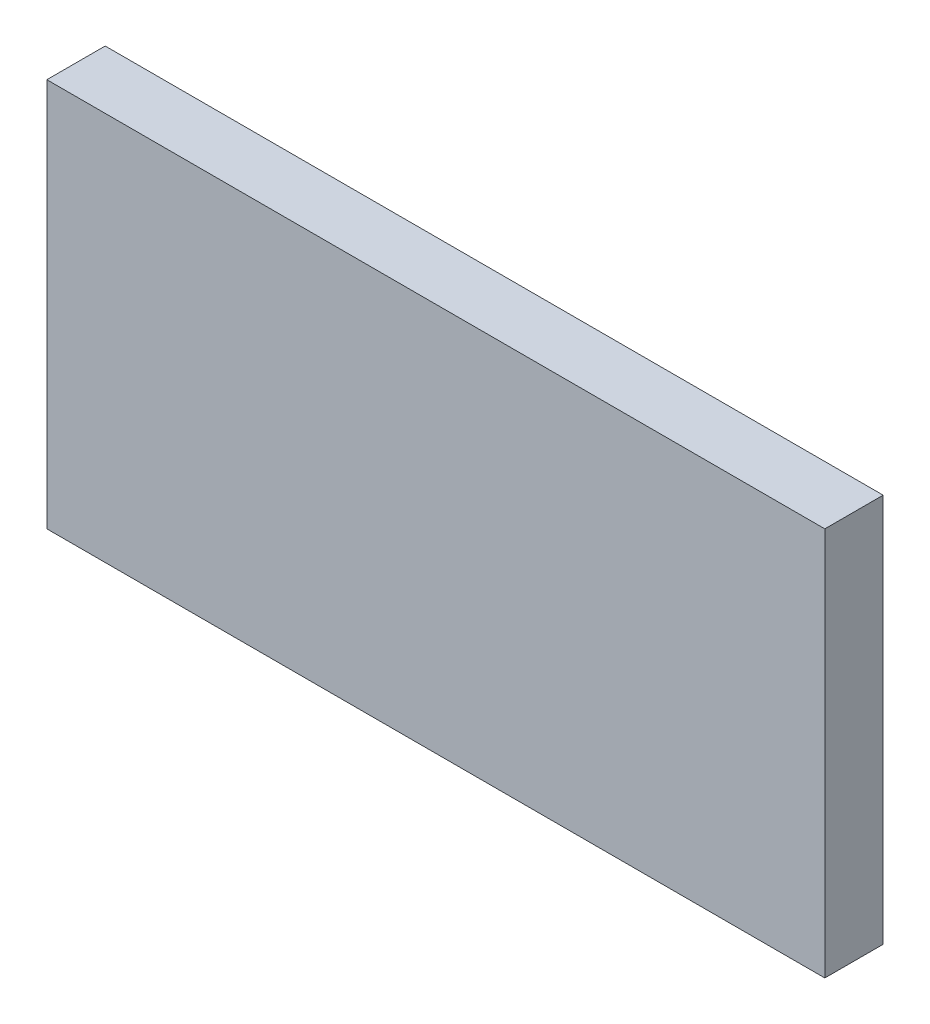
ISO-10303-21;
HEADER;
FILE_DESCRIPTION(('STEP AP214'),'2;1');
FILE_NAME('part.step','',(''),(''),'','','');
FILE_SCHEMA(('AUTOMOTIVE_DESIGN { 1 0 10303 214 1 1 1 1 }'));
ENDSEC;
DATA;
#1=APPLICATION_CONTEXT('core data for automotive mechanical design processes');
#2=APPLICATION_PROTOCOL_DEFINITION('international standard','automotive_design',2000,#1);
#3=PRODUCT_CONTEXT('',#1,'mechanical');
#4=PRODUCT('Part','Part','',(#3));
#5=PRODUCT_RELATED_PRODUCT_CATEGORY('part','',(#4));
#6=PRODUCT_DEFINITION_FORMATION('','',#4);
#7=PRODUCT_DEFINITION_CONTEXT('part definition',#1,'design');
#8=PRODUCT_DEFINITION('design','',#6,#7);
#9=PRODUCT_DEFINITION_SHAPE('','',#8);
#10=(LENGTH_UNIT() NAMED_UNIT(*) SI_UNIT(.MILLI.,.METRE.));
#11=(NAMED_UNIT(*) PLANE_ANGLE_UNIT() SI_UNIT($,.RADIAN.));
#12=(NAMED_UNIT(*) SI_UNIT($,.STERADIAN.) SOLID_ANGLE_UNIT());
#13=UNCERTAINTY_MEASURE_WITH_UNIT(LENGTH_MEASURE(1.E-05),#10,'distance_accuracy_value','');
#14=(GEOMETRIC_REPRESENTATION_CONTEXT(3) GLOBAL_UNCERTAINTY_ASSIGNED_CONTEXT((#13)) GLOBAL_UNIT_ASSIGNED_CONTEXT((#10,
#11,#12)) REPRESENTATION_CONTEXT('',''));
#15=CARTESIAN_POINT('',(0.,0.,0.));
#16=DIRECTION('',(0.,0.,1.));
#17=DIRECTION('',(1.,0.,0.));
#18=AXIS2_PLACEMENT_3D('',#15,#16,#17);
#19=CARTESIAN_POINT('',(-19.0244177165515,8.79518072289157,3.));
#20=DIRECTION('',(1.,0.,0.));
#21=DIRECTION('',(0.,1.,0.));
#22=AXIS2_PLACEMENT_3D('',#19,#20,#21);
#23=PLANE('',#22);
#24=DIRECTION('',(0.,-1.,0.));
#25=VECTOR('',#24,1.);
#26=CARTESIAN_POINT('',(-19.0244177165515,8.79518072289157,0.));
#27=LINE('',#26,#25);
#28=CARTESIAN_POINT('',(-19.0244177165515,8.79518072289157,0.));
#29=VERTEX_POINT('',#28);
#30=CARTESIAN_POINT('',(-19.0244177165515,-11.2048192771084,0.));
#31=VERTEX_POINT('',#30);
#32=EDGE_CURVE('E101',#29,#31,#27,.T.);
#33=ORIENTED_EDGE('',*,*,#32,.T.);
#34=DIRECTION('',(0.,0.,-1.));
#35=VECTOR('',#34,1.);
#36=CARTESIAN_POINT('',(-19.0244177165515,-11.2048192771084,3.));
#37=LINE('',#36,#35);
#38=CARTESIAN_POINT('',(-19.0244177165515,-11.2048192771084,3.));
#39=VERTEX_POINT('',#38);
#40=EDGE_CURVE('E11',#39,#31,#37,.T.);
#41=ORIENTED_EDGE('',*,*,#40,.F.);
#42=DIRECTION('',(0.,-1.,0.));
#43=VECTOR('',#42,1.);
#44=CARTESIAN_POINT('',(-19.0244177165515,8.79518072289157,3.));
#45=LINE('',#44,#43);
#46=CARTESIAN_POINT('',(-19.0244177165515,8.79518072289157,3.));
#47=VERTEX_POINT('',#46);
#48=EDGE_CURVE('E89',#47,#39,#45,.T.);
#49=ORIENTED_EDGE('',*,*,#48,.F.);
#50=DIRECTION('',(0.,0.,-1.));
#51=VECTOR('',#50,1.);
#52=CARTESIAN_POINT('',(-19.0244177165515,8.79518072289157,3.));
#53=LINE('',#52,#51);
#54=EDGE_CURVE('E97',#47,#29,#53,.T.);
#55=ORIENTED_EDGE('',*,*,#54,.T.);
#56=EDGE_LOOP('',(#33,#41,#49,#55));
#57=FACE_BOUND('',#56,.T.);
#58=ADVANCED_FACE('F38',(#57),#23,.F.);
#59=CARTESIAN_POINT('',(-19.0244177165515,-11.2048192771084,3.));
#60=DIRECTION('',(0.,1.,0.));
#61=DIRECTION('',(0.,0.,1.));
#62=AXIS2_PLACEMENT_3D('',#59,#60,#61);
#63=PLANE('',#62);
#64=DIRECTION('',(1.,0.,0.));
#65=VECTOR('',#64,1.);
#66=CARTESIAN_POINT('',(-19.0244177165515,-11.2048192771084,0.));
#67=LINE('',#66,#65);
#68=CARTESIAN_POINT('',(20.9755822834485,-11.2048192771084,0.));
#69=VERTEX_POINT('',#68);
#70=EDGE_CURVE('E93',#31,#69,#67,.T.);
#71=ORIENTED_EDGE('',*,*,#70,.T.);
#72=DIRECTION('',(0.,0.,-1.));
#73=VECTOR('',#72,1.);
#74=CARTESIAN_POINT('',(20.9755822834485,-11.2048192771084,3.));
#75=LINE('',#74,#73);
#76=CARTESIAN_POINT('',(20.9755822834485,-11.2048192771084,3.));
#77=VERTEX_POINT('',#76);
#78=EDGE_CURVE('E46',#77,#69,#75,.T.);
#79=ORIENTED_EDGE('',*,*,#78,.F.);
#80=DIRECTION('',(1.,0.,0.));
#81=VECTOR('',#80,1.);
#82=CARTESIAN_POINT('',(-19.0244177165515,-11.2048192771084,3.));
#83=LINE('',#82,#81);
#84=EDGE_CURVE('E84',#39,#77,#83,.T.);
#85=ORIENTED_EDGE('',*,*,#84,.F.);
#86=ORIENTED_EDGE('',*,*,#40,.T.);
#87=EDGE_LOOP('',(#71,#79,#85,#86));
#88=FACE_BOUND('',#87,.T.);
#89=ADVANCED_FACE('F92',(#88),#63,.F.);
#90=CARTESIAN_POINT('',(20.9755822834485,8.79518072289157,3.));
#91=DIRECTION('',(-1.,0.,0.));
#92=DIRECTION('',(0.,-1.,0.));
#93=AXIS2_PLACEMENT_3D('',#90,#91,#92);
#94=PLANE('',#93);
#95=DIRECTION('',(0.,1.,0.));
#96=VECTOR('',#95,1.);
#97=CARTESIAN_POINT('',(20.9755822834485,8.79518072289157,0.));
#98=LINE('',#97,#96);
#99=CARTESIAN_POINT('',(20.9755822834485,8.79518072289157,0.));
#100=VERTEX_POINT('',#99);
#101=EDGE_CURVE('E71',#69,#100,#98,.T.);
#102=ORIENTED_EDGE('',*,*,#101,.T.);
#103=DIRECTION('',(0.,0.,-1.));
#104=VECTOR('',#103,1.);
#105=CARTESIAN_POINT('',(20.9755822834485,8.79518072289157,3.));
#106=LINE('',#105,#104);
#107=CARTESIAN_POINT('',(20.9755822834485,8.79518072289157,3.));
#108=VERTEX_POINT('',#107);
#109=EDGE_CURVE('E94',#108,#100,#106,.T.);
#110=ORIENTED_EDGE('',*,*,#109,.F.);
#111=DIRECTION('',(0.,1.,0.));
#112=VECTOR('',#111,1.);
#113=CARTESIAN_POINT('',(20.9755822834485,8.79518072289157,3.));
#114=LINE('',#113,#112);
#115=EDGE_CURVE('E87',#77,#108,#114,.T.);
#116=ORIENTED_EDGE('',*,*,#115,.F.);
#117=ORIENTED_EDGE('',*,*,#78,.T.);
#118=EDGE_LOOP('',(#102,#110,#116,#117));
#119=FACE_BOUND('',#118,.T.);
#120=ADVANCED_FACE('F95',(#119),#94,.F.);
#121=CARTESIAN_POINT('',(-19.0244177165515,8.79518072289157,3.));
#122=DIRECTION('',(0.,-1.,0.));
#123=DIRECTION('',(0.,0.,-1.));
#124=AXIS2_PLACEMENT_3D('',#121,#122,#123);
#125=PLANE('',#124);
#126=DIRECTION('',(-1.,0.,0.));
#127=VECTOR('',#126,1.);
#128=CARTESIAN_POINT('',(-19.0244177165515,8.79518072289157,0.));
#129=LINE('',#128,#127);
#130=EDGE_CURVE('E77',#100,#29,#129,.T.);
#131=ORIENTED_EDGE('',*,*,#130,.T.);
#132=ORIENTED_EDGE('',*,*,#54,.F.);
#133=DIRECTION('',(-1.,0.,0.));
#134=VECTOR('',#133,1.);
#135=CARTESIAN_POINT('',(-19.0244177165515,8.79518072289157,3.));
#136=LINE('',#135,#134);
#137=EDGE_CURVE('E54',#108,#47,#136,.T.);
#138=ORIENTED_EDGE('',*,*,#137,.F.);
#139=ORIENTED_EDGE('',*,*,#109,.T.);
#140=EDGE_LOOP('',(#131,#132,#138,#139));
#141=FACE_BOUND('',#140,.T.);
#142=ADVANCED_FACE('F108',(#141),#125,.F.);
#143=CARTESIAN_POINT('',(0.,0.,3.));
#144=DIRECTION('',(0.,0.,1.));
#145=DIRECTION('',(1.,0.,0.));
#146=AXIS2_PLACEMENT_3D('',#143,#144,#145);
#147=PLANE('',#146);
#148=ORIENTED_EDGE('',*,*,#48,.T.);
#149=ORIENTED_EDGE('',*,*,#84,.T.);
#150=ORIENTED_EDGE('',*,*,#115,.T.);
#151=ORIENTED_EDGE('',*,*,#137,.T.);
#152=EDGE_LOOP('',(#148,#149,#150,#151));
#153=FACE_BOUND('',#152,.T.);
#154=ADVANCED_FACE('F85',(#153),#147,.T.);
#155=CARTESIAN_POINT('',(0.,0.,0.));
#156=DIRECTION('',(0.,0.,1.));
#157=DIRECTION('',(1.,0.,0.));
#158=AXIS2_PLACEMENT_3D('',#155,#156,#157);
#159=PLANE('',#158);
#160=ORIENTED_EDGE('',*,*,#32,.F.);
#161=ORIENTED_EDGE('',*,*,#130,.F.);
#162=ORIENTED_EDGE('',*,*,#101,.F.);
#163=ORIENTED_EDGE('',*,*,#70,.F.);
#164=EDGE_LOOP('',(#160,#161,#162,#163));
#165=FACE_BOUND('',#164,.T.);
#166=ADVANCED_FACE('F111',(#165),#159,.F.);
#167=CLOSED_SHELL('',(#58,#89,#120,#142,#154,#166));
#168=MANIFOLD_SOLID_BREP('B2',#167);
#169=ADVANCED_BREP_SHAPE_REPRESENTATION('',(#18,#168),#14);
#170=SHAPE_DEFINITION_REPRESENTATION(#9,#169);
ENDSEC;
END-ISO-10303-21;
